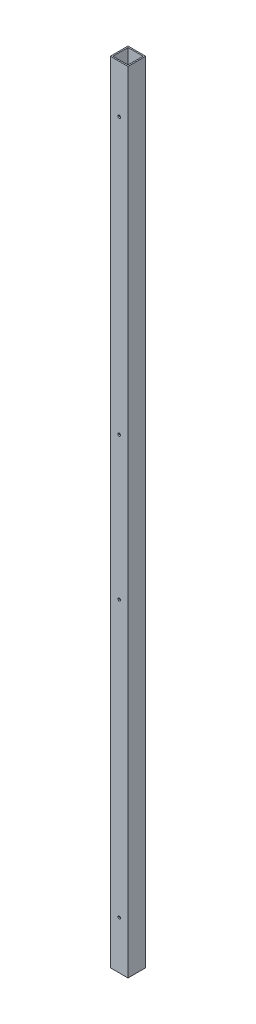
ISO-10303-21;
HEADER;
FILE_DESCRIPTION(('STEP AP214'),'2;1');
FILE_NAME('part.step','',(''),(''),'','','');
FILE_SCHEMA(('AUTOMOTIVE_DESIGN { 1 0 10303 214 1 1 1 1 }'));
ENDSEC;
DATA;
#1=APPLICATION_CONTEXT('core data for automotive mechanical design processes');
#2=APPLICATION_PROTOCOL_DEFINITION('international standard','automotive_design',2000,#1);
#3=PRODUCT_CONTEXT('',#1,'mechanical');
#4=PRODUCT('Part','Part','',(#3));
#5=PRODUCT_RELATED_PRODUCT_CATEGORY('part','',(#4));
#6=PRODUCT_DEFINITION_FORMATION('','',#4);
#7=PRODUCT_DEFINITION_CONTEXT('part definition',#1,'design');
#8=PRODUCT_DEFINITION('design','',#6,#7);
#9=PRODUCT_DEFINITION_SHAPE('','',#8);
#10=(LENGTH_UNIT() NAMED_UNIT(*) SI_UNIT(.MILLI.,.METRE.));
#11=(NAMED_UNIT(*) PLANE_ANGLE_UNIT() SI_UNIT($,.RADIAN.));
#12=(NAMED_UNIT(*) SI_UNIT($,.STERADIAN.) SOLID_ANGLE_UNIT());
#13=UNCERTAINTY_MEASURE_WITH_UNIT(LENGTH_MEASURE(1.E-05),#10,'distance_accuracy_value','');
#14=(GEOMETRIC_REPRESENTATION_CONTEXT(3) GLOBAL_UNCERTAINTY_ASSIGNED_CONTEXT((#13)) GLOBAL_UNIT_ASSIGNED_CONTEXT((#10,
#11,#12)) REPRESENTATION_CONTEXT('',''));
#15=CARTESIAN_POINT('',(0.,0.,0.));
#16=DIRECTION('',(0.,0.,1.));
#17=DIRECTION('',(1.,0.,0.));
#18=AXIS2_PLACEMENT_3D('',#15,#16,#17);
#19=CARTESIAN_POINT('',(0.,1984.375,0.));
#20=DIRECTION('',(0.,-1.,0.));
#21=DIRECTION('',(0.,0.,-1.));
#22=AXIS2_PLACEMENT_3D('',#19,#20,#21);
#23=PLANE('',#22);
#24=DIRECTION('',(0.,0.,-1.));
#25=VECTOR('',#24,1.);
#26=CARTESIAN_POINT('',(22.225,1984.375,22.225));
#27=LINE('',#26,#25);
#28=CARTESIAN_POINT('',(22.225,1984.375,22.225));
#29=VERTEX_POINT('',#28);
#30=CARTESIAN_POINT('',(22.225,1984.375,-22.225));
#31=VERTEX_POINT('',#30);
#32=EDGE_CURVE('E138',#29,#31,#27,.T.);
#33=ORIENTED_EDGE('',*,*,#32,.T.);
#34=DIRECTION('',(-1.,0.,0.));
#35=VECTOR('',#34,1.);
#36=CARTESIAN_POINT('',(-22.225,1984.375,-22.225));
#37=LINE('',#36,#35);
#38=CARTESIAN_POINT('',(-22.225,1984.375,-22.225));
#39=VERTEX_POINT('',#38);
#40=EDGE_CURVE('E141',#31,#39,#37,.T.);
#41=ORIENTED_EDGE('',*,*,#40,.T.);
#42=DIRECTION('',(0.,0.,1.));
#43=VECTOR('',#42,1.);
#44=CARTESIAN_POINT('',(-22.225,1984.375,22.225));
#45=LINE('',#44,#43);
#46=CARTESIAN_POINT('',(-22.225,1984.375,22.225));
#47=VERTEX_POINT('',#46);
#48=EDGE_CURVE('E144',#39,#47,#45,.T.);
#49=ORIENTED_EDGE('',*,*,#48,.T.);
#50=DIRECTION('',(1.,0.,0.));
#51=VECTOR('',#50,1.);
#52=CARTESIAN_POINT('',(-22.225,1984.375,22.225));
#53=LINE('',#52,#51);
#54=EDGE_CURVE('E146',#47,#29,#53,.T.);
#55=ORIENTED_EDGE('',*,*,#54,.T.);
#56=EDGE_LOOP('',(#33,#41,#49,#55));
#57=FACE_BOUND('',#56,.T.);
#58=DIRECTION('',(0.,0.,-1.));
#59=VECTOR('',#58,1.);
#60=CARTESIAN_POINT('',(19.05,1984.375,19.05));
#61=LINE('',#60,#59);
#62=CARTESIAN_POINT('',(19.05,1984.375,19.05));
#63=VERTEX_POINT('',#62);
#64=CARTESIAN_POINT('',(19.05,1984.375,-19.05));
#65=VERTEX_POINT('',#64);
#66=EDGE_CURVE('E100',#63,#65,#61,.T.);
#67=ORIENTED_EDGE('',*,*,#66,.F.);
#68=DIRECTION('',(1.,0.,0.));
#69=VECTOR('',#68,1.);
#70=CARTESIAN_POINT('',(-19.05,1984.375,19.05));
#71=LINE('',#70,#69);
#72=CARTESIAN_POINT('',(-19.05,1984.375,19.05));
#73=VERTEX_POINT('',#72);
#74=EDGE_CURVE('E122',#73,#63,#71,.T.);
#75=ORIENTED_EDGE('',*,*,#74,.F.);
#76=DIRECTION('',(0.,0.,1.));
#77=VECTOR('',#76,1.);
#78=CARTESIAN_POINT('',(-19.05,1984.375,19.05));
#79=LINE('',#78,#77);
#80=CARTESIAN_POINT('',(-19.05,1984.375,-19.05));
#81=VERTEX_POINT('',#80);
#82=EDGE_CURVE('E120',#81,#73,#79,.T.);
#83=ORIENTED_EDGE('',*,*,#82,.F.);
#84=DIRECTION('',(-1.,0.,0.));
#85=VECTOR('',#84,1.);
#86=CARTESIAN_POINT('',(-19.05,1984.375,-19.05));
#87=LINE('',#86,#85);
#88=EDGE_CURVE('E108',#65,#81,#87,.T.);
#89=ORIENTED_EDGE('',*,*,#88,.F.);
#90=EDGE_LOOP('',(#67,#75,#83,#89));
#91=FACE_BOUND('',#90,.T.);
#92=ADVANCED_FACE('F33',(#57,#91),#23,.F.);
#93=CARTESIAN_POINT('',(0.,0.,0.));
#94=DIRECTION('',(0.,-1.,0.));
#95=DIRECTION('',(0.,0.,-1.));
#96=AXIS2_PLACEMENT_3D('',#93,#94,#95);
#97=PLANE('',#96);
#98=DIRECTION('',(0.,0.,-1.));
#99=VECTOR('',#98,1.);
#100=CARTESIAN_POINT('',(22.225,0.,22.225));
#101=LINE('',#100,#99);
#102=CARTESIAN_POINT('',(22.225,0.,22.225));
#103=VERTEX_POINT('',#102);
#104=CARTESIAN_POINT('',(22.225,0.,-22.225));
#105=VERTEX_POINT('',#104);
#106=EDGE_CURVE('E116',#103,#105,#101,.T.);
#107=ORIENTED_EDGE('',*,*,#106,.F.);
#108=DIRECTION('',(1.,0.,0.));
#109=VECTOR('',#108,1.);
#110=CARTESIAN_POINT('',(-22.225,0.,22.225));
#111=LINE('',#110,#109);
#112=CARTESIAN_POINT('',(-22.225,0.,22.225));
#113=VERTEX_POINT('',#112);
#114=EDGE_CURVE('E142',#113,#103,#111,.T.);
#115=ORIENTED_EDGE('',*,*,#114,.F.);
#116=DIRECTION('',(0.,0.,1.));
#117=VECTOR('',#116,1.);
#118=CARTESIAN_POINT('',(-22.225,0.,22.225));
#119=LINE('',#118,#117);
#120=CARTESIAN_POINT('',(-22.225,0.,-22.225));
#121=VERTEX_POINT('',#120);
#122=EDGE_CURVE('E153',#121,#113,#119,.T.);
#123=ORIENTED_EDGE('',*,*,#122,.F.);
#124=DIRECTION('',(-1.,0.,0.));
#125=VECTOR('',#124,1.);
#126=CARTESIAN_POINT('',(-22.225,0.,-22.225));
#127=LINE('',#126,#125);
#128=EDGE_CURVE('E151',#105,#121,#127,.T.);
#129=ORIENTED_EDGE('',*,*,#128,.F.);
#130=EDGE_LOOP('',(#107,#115,#123,#129));
#131=FACE_BOUND('',#130,.T.);
#132=DIRECTION('',(1.,0.,0.));
#133=VECTOR('',#132,1.);
#134=CARTESIAN_POINT('',(-19.05,0.,19.05));
#135=LINE('',#134,#133);
#136=CARTESIAN_POINT('',(-19.05,0.,19.05));
#137=VERTEX_POINT('',#136);
#138=CARTESIAN_POINT('',(19.05,0.,19.05));
#139=VERTEX_POINT('',#138);
#140=EDGE_CURVE('E109',#137,#139,#135,.T.);
#141=ORIENTED_EDGE('',*,*,#140,.T.);
#142=DIRECTION('',(0.,0.,-1.));
#143=VECTOR('',#142,1.);
#144=CARTESIAN_POINT('',(19.05,0.,19.05));
#145=LINE('',#144,#143);
#146=CARTESIAN_POINT('',(19.05,0.,-19.05));
#147=VERTEX_POINT('',#146);
#148=EDGE_CURVE('E58',#139,#147,#145,.T.);
#149=ORIENTED_EDGE('',*,*,#148,.T.);
#150=DIRECTION('',(-1.,0.,0.));
#151=VECTOR('',#150,1.);
#152=CARTESIAN_POINT('',(-19.05,0.,-19.05));
#153=LINE('',#152,#151);
#154=CARTESIAN_POINT('',(-19.05,0.,-19.05));
#155=VERTEX_POINT('',#154);
#156=EDGE_CURVE('E115',#147,#155,#153,.T.);
#157=ORIENTED_EDGE('',*,*,#156,.T.);
#158=DIRECTION('',(0.,0.,1.));
#159=VECTOR('',#158,1.);
#160=CARTESIAN_POINT('',(-19.05,0.,19.05));
#161=LINE('',#160,#159);
#162=EDGE_CURVE('E130',#155,#137,#161,.T.);
#163=ORIENTED_EDGE('',*,*,#162,.T.);
#164=EDGE_LOOP('',(#141,#149,#157,#163));
#165=FACE_BOUND('',#164,.T.);
#166=ADVANCED_FACE('F214',(#131,#165),#97,.T.);
#167=CARTESIAN_POINT('',(22.225,1984.375,22.225));
#168=DIRECTION('',(-1.,0.,0.));
#169=DIRECTION('',(0.,0.,1.));
#170=AXIS2_PLACEMENT_3D('',#167,#168,#169);
#171=PLANE('',#170);
#172=ORIENTED_EDGE('',*,*,#106,.T.);
#173=DIRECTION('',(0.,-1.,0.));
#174=VECTOR('',#173,1.);
#175=CARTESIAN_POINT('',(22.225,1984.375,-22.225));
#176=LINE('',#175,#174);
#177=EDGE_CURVE('E11',#31,#105,#176,.T.);
#178=ORIENTED_EDGE('',*,*,#177,.F.);
#179=ORIENTED_EDGE('',*,*,#32,.F.);
#180=DIRECTION('',(0.,-1.,0.));
#181=VECTOR('',#180,1.);
#182=CARTESIAN_POINT('',(22.225,1984.375,22.225));
#183=LINE('',#182,#181);
#184=EDGE_CURVE('E148',#29,#103,#183,.T.);
#185=ORIENTED_EDGE('',*,*,#184,.T.);
#186=EDGE_LOOP('',(#172,#178,#179,#185));
#187=FACE_BOUND('',#186,.T.);
#188=ADVANCED_FACE('F35',(#187),#171,.F.);
#189=CARTESIAN_POINT('',(-22.225,1984.375,-22.225));
#190=DIRECTION('',(0.,0.,1.));
#191=DIRECTION('',(1.,0.,0.));
#192=AXIS2_PLACEMENT_3D('',#189,#190,#191);
#193=PLANE('',#192);
#194=CARTESIAN_POINT('',(0.,812.8,-22.225));
#195=DIRECTION('',(0.,0.,1.));
#196=DIRECTION('',(1.,0.,0.));
#197=AXIS2_PLACEMENT_3D('',#194,#195,#196);
#198=CIRCLE('',#197,3.37350099999999);
#199=CARTESIAN_POINT('',(3.37350099999999,812.8,-22.225));
#200=VERTEX_POINT('',#199);
#201=EDGE_CURVE('E249',#200,#200,#198,.T.);
#202=ORIENTED_EDGE('',*,*,#201,.T.);
#203=EDGE_LOOP('',(#202));
#204=FACE_BOUND('',#203,.T.);
#205=CARTESIAN_POINT('',(0.,120.65,-22.225));
#206=DIRECTION('',(0.,0.,1.));
#207=DIRECTION('',(1.,0.,0.));
#208=AXIS2_PLACEMENT_3D('',#205,#206,#207);
#209=CIRCLE('',#208,3.37350099999999);
#210=CARTESIAN_POINT('',(3.37350099999999,120.65,-22.225));
#211=VERTEX_POINT('',#210);
#212=EDGE_CURVE('E174',#211,#211,#209,.T.);
#213=ORIENTED_EDGE('',*,*,#212,.T.);
#214=EDGE_LOOP('',(#213));
#215=FACE_BOUND('',#214,.T.);
#216=CARTESIAN_POINT('',(0.,1171.575,-22.225));
#217=DIRECTION('',(0.,0.,1.));
#218=DIRECTION('',(1.,0.,0.));
#219=AXIS2_PLACEMENT_3D('',#216,#217,#218);
#220=CIRCLE('',#219,3.37350099999999);
#221=CARTESIAN_POINT('',(3.37350099999998,1171.575,-22.225));
#222=VERTEX_POINT('',#221);
#223=EDGE_CURVE('E170',#222,#222,#220,.T.);
#224=ORIENTED_EDGE('',*,*,#223,.T.);
#225=EDGE_LOOP('',(#224));
#226=FACE_BOUND('',#225,.T.);
#227=CARTESIAN_POINT('',(0.,1863.725,-22.225));
#228=DIRECTION('',(0.,0.,1.));
#229=DIRECTION('',(1.,0.,0.));
#230=AXIS2_PLACEMENT_3D('',#227,#228,#229);
#231=CIRCLE('',#230,3.37350099999999);
#232=CARTESIAN_POINT('',(3.37350099999998,1863.725,-22.225));
#233=VERTEX_POINT('',#232);
#234=EDGE_CURVE('E166',#233,#233,#231,.T.);
#235=ORIENTED_EDGE('',*,*,#234,.T.);
#236=EDGE_LOOP('',(#235));
#237=FACE_BOUND('',#236,.T.);
#238=ORIENTED_EDGE('',*,*,#128,.T.);
#239=DIRECTION('',(0.,-1.,0.));
#240=VECTOR('',#239,1.);
#241=CARTESIAN_POINT('',(-22.225,1984.375,-22.225));
#242=LINE('',#241,#240);
#243=EDGE_CURVE('E42',#39,#121,#242,.T.);
#244=ORIENTED_EDGE('',*,*,#243,.F.);
#245=ORIENTED_EDGE('',*,*,#40,.F.);
#246=ORIENTED_EDGE('',*,*,#177,.T.);
#247=EDGE_LOOP('',(#238,#244,#245,#246));
#248=FACE_BOUND('',#247,.T.);
#249=ADVANCED_FACE('F239',(#204,#215,#226,#237,#248),#193,.F.);
#250=CARTESIAN_POINT('',(-22.225,1984.375,22.225));
#251=DIRECTION('',(1.,0.,0.));
#252=DIRECTION('',(0.,0.,-1.));
#253=AXIS2_PLACEMENT_3D('',#250,#251,#252);
#254=PLANE('',#253);
#255=ORIENTED_EDGE('',*,*,#122,.T.);
#256=DIRECTION('',(0.,-1.,0.));
#257=VECTOR('',#256,1.);
#258=CARTESIAN_POINT('',(-22.225,1984.375,22.225));
#259=LINE('',#258,#257);
#260=EDGE_CURVE('E158',#47,#113,#259,.T.);
#261=ORIENTED_EDGE('',*,*,#260,.F.);
#262=ORIENTED_EDGE('',*,*,#48,.F.);
#263=ORIENTED_EDGE('',*,*,#243,.T.);
#264=EDGE_LOOP('',(#255,#261,#262,#263));
#265=FACE_BOUND('',#264,.T.);
#266=ADVANCED_FACE('F236',(#265),#254,.F.);
#267=CARTESIAN_POINT('',(-22.225,1984.375,22.225));
#268=DIRECTION('',(0.,0.,-1.));
#269=DIRECTION('',(-1.,0.,0.));
#270=AXIS2_PLACEMENT_3D('',#267,#268,#269);
#271=PLANE('',#270);
#272=CARTESIAN_POINT('',(0.,812.8,22.225));
#273=DIRECTION('',(0.,0.,1.));
#274=DIRECTION('',(1.,0.,0.));
#275=AXIS2_PLACEMENT_3D('',#272,#273,#274);
#276=CIRCLE('',#275,3.37350099999999);
#277=CARTESIAN_POINT('',(3.37350099999999,812.8,22.225));
#278=VERTEX_POINT('',#277);
#279=EDGE_CURVE('E296',#278,#278,#276,.T.);
#280=ORIENTED_EDGE('',*,*,#279,.F.);
#281=EDGE_LOOP('',(#280));
#282=FACE_BOUND('',#281,.T.);
#283=CARTESIAN_POINT('',(0.,120.65,22.225));
#284=DIRECTION('',(0.,0.,1.));
#285=DIRECTION('',(1.,0.,0.));
#286=AXIS2_PLACEMENT_3D('',#283,#284,#285);
#287=CIRCLE('',#286,3.37350099999999);
#288=CARTESIAN_POINT('',(3.37350099999999,120.65,22.225));
#289=VERTEX_POINT('',#288);
#290=EDGE_CURVE('E181',#289,#289,#287,.T.);
#291=ORIENTED_EDGE('',*,*,#290,.F.);
#292=EDGE_LOOP('',(#291));
#293=FACE_BOUND('',#292,.T.);
#294=CARTESIAN_POINT('',(0.,1171.575,22.225));
#295=DIRECTION('',(0.,0.,1.));
#296=DIRECTION('',(1.,0.,0.));
#297=AXIS2_PLACEMENT_3D('',#294,#295,#296);
#298=CIRCLE('',#297,3.37350099999999);
#299=CARTESIAN_POINT('',(3.37350099999997,1171.575,22.225));
#300=VERTEX_POINT('',#299);
#301=EDGE_CURVE('E178',#300,#300,#298,.T.);
#302=ORIENTED_EDGE('',*,*,#301,.F.);
#303=EDGE_LOOP('',(#302));
#304=FACE_BOUND('',#303,.T.);
#305=CARTESIAN_POINT('',(0.,1863.725,22.225));
#306=DIRECTION('',(0.,0.,1.));
#307=DIRECTION('',(1.,0.,0.));
#308=AXIS2_PLACEMENT_3D('',#305,#306,#307);
#309=CIRCLE('',#308,3.37350099999999);
#310=CARTESIAN_POINT('',(3.37350099999997,1863.725,22.225));
#311=VERTEX_POINT('',#310);
#312=EDGE_CURVE('E196',#311,#311,#309,.T.);
#313=ORIENTED_EDGE('',*,*,#312,.F.);
#314=EDGE_LOOP('',(#313));
#315=FACE_BOUND('',#314,.T.);
#316=ORIENTED_EDGE('',*,*,#114,.T.);
#317=ORIENTED_EDGE('',*,*,#184,.F.);
#318=ORIENTED_EDGE('',*,*,#54,.F.);
#319=ORIENTED_EDGE('',*,*,#260,.T.);
#320=EDGE_LOOP('',(#316,#317,#318,#319));
#321=FACE_BOUND('',#320,.T.);
#322=ADVANCED_FACE('F233',(#282,#293,#304,#315,#321),#271,.F.);
#323=CARTESIAN_POINT('',(19.05,1984.375,19.05));
#324=DIRECTION('',(-1.,0.,0.));
#325=DIRECTION('',(0.,0.,1.));
#326=AXIS2_PLACEMENT_3D('',#323,#324,#325);
#327=PLANE('',#326);
#328=ORIENTED_EDGE('',*,*,#148,.F.);
#329=DIRECTION('',(0.,-1.,0.));
#330=VECTOR('',#329,1.);
#331=CARTESIAN_POINT('',(19.05,1984.375,19.05));
#332=LINE('',#331,#330);
#333=EDGE_CURVE('E104',#63,#139,#332,.T.);
#334=ORIENTED_EDGE('',*,*,#333,.F.);
#335=ORIENTED_EDGE('',*,*,#66,.T.);
#336=DIRECTION('',(0.,-1.,0.));
#337=VECTOR('',#336,1.);
#338=CARTESIAN_POINT('',(19.05,1984.375,-19.05));
#339=LINE('',#338,#337);
#340=EDGE_CURVE('E103',#65,#147,#339,.T.);
#341=ORIENTED_EDGE('',*,*,#340,.T.);
#342=EDGE_LOOP('',(#328,#334,#335,#341));
#343=FACE_BOUND('',#342,.T.);
#344=ADVANCED_FACE('F102',(#343),#327,.T.);
#345=CARTESIAN_POINT('',(-19.05,1984.375,-19.05));
#346=DIRECTION('',(0.,0.,1.));
#347=DIRECTION('',(1.,0.,0.));
#348=AXIS2_PLACEMENT_3D('',#345,#346,#347);
#349=PLANE('',#348);
#350=CARTESIAN_POINT('',(0.,812.8,-19.05));
#351=DIRECTION('',(0.,0.,1.));
#352=DIRECTION('',(1.,0.,0.));
#353=AXIS2_PLACEMENT_3D('',#350,#351,#352);
#354=CIRCLE('',#353,3.37350099999999);
#355=CARTESIAN_POINT('',(3.37350099999999,812.8,-19.05));
#356=VERTEX_POINT('',#355);
#357=EDGE_CURVE('E37',#356,#356,#354,.T.);
#358=ORIENTED_EDGE('',*,*,#357,.F.);
#359=EDGE_LOOP('',(#358));
#360=FACE_BOUND('',#359,.T.);
#361=CARTESIAN_POINT('',(0.,120.65,-19.05));
#362=DIRECTION('',(0.,0.,1.));
#363=DIRECTION('',(1.,0.,0.));
#364=AXIS2_PLACEMENT_3D('',#361,#362,#363);
#365=CIRCLE('',#364,3.37350099999999);
#366=CARTESIAN_POINT('',(3.37350099999999,120.65,-19.05));
#367=VERTEX_POINT('',#366);
#368=EDGE_CURVE('E173',#367,#367,#365,.T.);
#369=ORIENTED_EDGE('',*,*,#368,.F.);
#370=EDGE_LOOP('',(#369));
#371=FACE_BOUND('',#370,.T.);
#372=CARTESIAN_POINT('',(0.,1171.575,-19.05));
#373=DIRECTION('',(0.,0.,1.));
#374=DIRECTION('',(1.,0.,0.));
#375=AXIS2_PLACEMENT_3D('',#372,#373,#374);
#376=CIRCLE('',#375,3.37350099999999);
#377=CARTESIAN_POINT('',(3.37350099999998,1171.575,-19.05));
#378=VERTEX_POINT('',#377);
#379=EDGE_CURVE('E169',#378,#378,#376,.T.);
#380=ORIENTED_EDGE('',*,*,#379,.F.);
#381=EDGE_LOOP('',(#380));
#382=FACE_BOUND('',#381,.T.);
#383=CARTESIAN_POINT('',(0.,1863.725,-19.05));
#384=DIRECTION('',(0.,0.,1.));
#385=DIRECTION('',(1.,0.,0.));
#386=AXIS2_PLACEMENT_3D('',#383,#384,#385);
#387=CIRCLE('',#386,3.37350099999999);
#388=CARTESIAN_POINT('',(3.37350099999998,1863.725,-19.05));
#389=VERTEX_POINT('',#388);
#390=EDGE_CURVE('E163',#389,#389,#387,.T.);
#391=ORIENTED_EDGE('',*,*,#390,.F.);
#392=EDGE_LOOP('',(#391));
#393=FACE_BOUND('',#392,.T.);
#394=ORIENTED_EDGE('',*,*,#156,.F.);
#395=ORIENTED_EDGE('',*,*,#340,.F.);
#396=ORIENTED_EDGE('',*,*,#88,.T.);
#397=DIRECTION('',(0.,-1.,0.));
#398=VECTOR('',#397,1.);
#399=CARTESIAN_POINT('',(-19.05,1984.375,-19.05));
#400=LINE('',#399,#398);
#401=EDGE_CURVE('E117',#81,#155,#400,.T.);
#402=ORIENTED_EDGE('',*,*,#401,.T.);
#403=EDGE_LOOP('',(#394,#395,#396,#402));
#404=FACE_BOUND('',#403,.T.);
#405=ADVANCED_FACE('F112',(#360,#371,#382,#393,#404),#349,.T.);
#406=CARTESIAN_POINT('',(-19.05,1984.375,19.05));
#407=DIRECTION('',(1.,0.,0.));
#408=DIRECTION('',(0.,0.,-1.));
#409=AXIS2_PLACEMENT_3D('',#406,#407,#408);
#410=PLANE('',#409);
#411=ORIENTED_EDGE('',*,*,#162,.F.);
#412=ORIENTED_EDGE('',*,*,#401,.F.);
#413=ORIENTED_EDGE('',*,*,#82,.T.);
#414=DIRECTION('',(0.,-1.,0.));
#415=VECTOR('',#414,1.);
#416=CARTESIAN_POINT('',(-19.05,1984.375,19.05));
#417=LINE('',#416,#415);
#418=EDGE_CURVE('E50',#73,#137,#417,.T.);
#419=ORIENTED_EDGE('',*,*,#418,.T.);
#420=EDGE_LOOP('',(#411,#412,#413,#419));
#421=FACE_BOUND('',#420,.T.);
#422=ADVANCED_FACE('F209',(#421),#410,.T.);
#423=CARTESIAN_POINT('',(-19.05,1984.375,19.05));
#424=DIRECTION('',(0.,0.,-1.));
#425=DIRECTION('',(-1.,0.,0.));
#426=AXIS2_PLACEMENT_3D('',#423,#424,#425);
#427=PLANE('',#426);
#428=CARTESIAN_POINT('',(0.,812.8,19.05));
#429=DIRECTION('',(0.,0.,-1.));
#430=DIRECTION('',(-1.,0.,0.));
#431=AXIS2_PLACEMENT_3D('',#428,#429,#430);
#432=CIRCLE('',#431,3.37350099999999);
#433=CARTESIAN_POINT('',(-3.37350099999999,812.8,19.05));
#434=VERTEX_POINT('',#433);
#435=EDGE_CURVE('E186',#434,#434,#432,.T.);
#436=ORIENTED_EDGE('',*,*,#435,.F.);
#437=EDGE_LOOP('',(#436));
#438=FACE_BOUND('',#437,.T.);
#439=CARTESIAN_POINT('',(0.,120.65,19.05));
#440=DIRECTION('',(0.,0.,-1.));
#441=DIRECTION('',(-1.,0.,0.));
#442=AXIS2_PLACEMENT_3D('',#439,#440,#441);
#443=CIRCLE('',#442,3.37350099999999);
#444=CARTESIAN_POINT('',(-3.37350099999999,120.65,19.05));
#445=VERTEX_POINT('',#444);
#446=EDGE_CURVE('E171',#445,#445,#443,.T.);
#447=ORIENTED_EDGE('',*,*,#446,.F.);
#448=EDGE_LOOP('',(#447));
#449=FACE_BOUND('',#448,.T.);
#450=CARTESIAN_POINT('',(0.,1171.575,19.05));
#451=DIRECTION('',(0.,0.,-1.));
#452=DIRECTION('',(-1.,0.,0.));
#453=AXIS2_PLACEMENT_3D('',#450,#451,#452);
#454=CIRCLE('',#453,3.37350099999999);
#455=CARTESIAN_POINT('',(-3.37350100000001,1171.575,19.05));
#456=VERTEX_POINT('',#455);
#457=EDGE_CURVE('E167',#456,#456,#454,.T.);
#458=ORIENTED_EDGE('',*,*,#457,.F.);
#459=EDGE_LOOP('',(#458));
#460=FACE_BOUND('',#459,.T.);
#461=CARTESIAN_POINT('',(0.,1863.725,19.05));
#462=DIRECTION('',(0.,0.,-1.));
#463=DIRECTION('',(-1.,0.,0.));
#464=AXIS2_PLACEMENT_3D('',#461,#462,#463);
#465=CIRCLE('',#464,3.37350099999999);
#466=CARTESIAN_POINT('',(-3.37350100000001,1863.725,19.05));
#467=VERTEX_POINT('',#466);
#468=EDGE_CURVE('E128',#467,#467,#465,.T.);
#469=ORIENTED_EDGE('',*,*,#468,.F.);
#470=EDGE_LOOP('',(#469));
#471=FACE_BOUND('',#470,.T.);
#472=ORIENTED_EDGE('',*,*,#140,.F.);
#473=ORIENTED_EDGE('',*,*,#418,.F.);
#474=ORIENTED_EDGE('',*,*,#74,.T.);
#475=ORIENTED_EDGE('',*,*,#333,.T.);
#476=EDGE_LOOP('',(#472,#473,#474,#475));
#477=FACE_BOUND('',#476,.T.);
#478=ADVANCED_FACE('F206',(#438,#449,#460,#471,#477),#427,.T.);
#479=CARTESIAN_POINT('',(0.,1863.725,22.225));
#480=DIRECTION('',(0.,0.,1.));
#481=DIRECTION('',(1.,0.,0.));
#482=AXIS2_PLACEMENT_3D('',#479,#480,#481);
#483=CYLINDRICAL_SURFACE('',#482,3.37350099999999);
#484=ORIENTED_EDGE('',*,*,#390,.T.);
#485=EDGE_LOOP('',(#484));
#486=FACE_BOUND('',#485,.T.);
#487=ORIENTED_EDGE('',*,*,#234,.F.);
#488=EDGE_LOOP('',(#487));
#489=FACE_BOUND('',#488,.T.);
#490=ADVANCED_FACE('F208',(#486,#489),#483,.F.);
#491=ORIENTED_EDGE('',*,*,#468,.T.);
#492=EDGE_LOOP('',(#491));
#493=FACE_BOUND('',#492,.T.);
#494=ORIENTED_EDGE('',*,*,#312,.T.);
#495=EDGE_LOOP('',(#494));
#496=FACE_BOUND('',#495,.T.);
#497=ADVANCED_FACE('F203',(#493,#496),#483,.F.);
#498=CARTESIAN_POINT('',(0.,1171.575,22.225));
#499=DIRECTION('',(0.,0.,1.));
#500=DIRECTION('',(1.,0.,0.));
#501=AXIS2_PLACEMENT_3D('',#498,#499,#500);
#502=CYLINDRICAL_SURFACE('',#501,3.37350099999999);
#503=ORIENTED_EDGE('',*,*,#457,.T.);
#504=EDGE_LOOP('',(#503));
#505=FACE_BOUND('',#504,.T.);
#506=ORIENTED_EDGE('',*,*,#301,.T.);
#507=EDGE_LOOP('',(#506));
#508=FACE_BOUND('',#507,.T.);
#509=ADVANCED_FACE('F273',(#505,#508),#502,.F.);
#510=ORIENTED_EDGE('',*,*,#379,.T.);
#511=EDGE_LOOP('',(#510));
#512=FACE_BOUND('',#511,.T.);
#513=ORIENTED_EDGE('',*,*,#223,.F.);
#514=EDGE_LOOP('',(#513));
#515=FACE_BOUND('',#514,.T.);
#516=ADVANCED_FACE('F277',(#512,#515),#502,.F.);
#517=CARTESIAN_POINT('',(0.,120.65,22.225));
#518=DIRECTION('',(0.,0.,1.));
#519=DIRECTION('',(1.,0.,0.));
#520=AXIS2_PLACEMENT_3D('',#517,#518,#519);
#521=CYLINDRICAL_SURFACE('',#520,3.37350099999999);
#522=ORIENTED_EDGE('',*,*,#446,.T.);
#523=EDGE_LOOP('',(#522));
#524=FACE_BOUND('',#523,.T.);
#525=ORIENTED_EDGE('',*,*,#290,.T.);
#526=EDGE_LOOP('',(#525));
#527=FACE_BOUND('',#526,.T.);
#528=ADVANCED_FACE('F279',(#524,#527),#521,.F.);
#529=ORIENTED_EDGE('',*,*,#368,.T.);
#530=EDGE_LOOP('',(#529));
#531=FACE_BOUND('',#530,.T.);
#532=ORIENTED_EDGE('',*,*,#212,.F.);
#533=EDGE_LOOP('',(#532));
#534=FACE_BOUND('',#533,.T.);
#535=ADVANCED_FACE('F282',(#531,#534),#521,.F.);
#536=CARTESIAN_POINT('',(0.,812.8,22.225));
#537=DIRECTION('',(0.,0.,1.));
#538=DIRECTION('',(1.,0.,0.));
#539=AXIS2_PLACEMENT_3D('',#536,#537,#538);
#540=CYLINDRICAL_SURFACE('',#539,3.37350099999999);
#541=ORIENTED_EDGE('',*,*,#357,.T.);
#542=EDGE_LOOP('',(#541));
#543=FACE_BOUND('',#542,.T.);
#544=ORIENTED_EDGE('',*,*,#201,.F.);
#545=EDGE_LOOP('',(#544));
#546=FACE_BOUND('',#545,.T.);
#547=ADVANCED_FACE('F283',(#543,#546),#540,.F.);
#548=ORIENTED_EDGE('',*,*,#435,.T.);
#549=EDGE_LOOP('',(#548));
#550=FACE_BOUND('',#549,.T.);
#551=ORIENTED_EDGE('',*,*,#279,.T.);
#552=EDGE_LOOP('',(#551));
#553=FACE_BOUND('',#552,.T.);
#554=ADVANCED_FACE('F285',(#550,#553),#540,.F.);
#555=CLOSED_SHELL('',(#92,#166,#188,#249,#266,#322,#344,#405,#422,#478,#490,#497,#509,#516,#528,
#535,#547,#554));
#556=MANIFOLD_SOLID_BREP('B2',#555);
#557=ADVANCED_BREP_SHAPE_REPRESENTATION('',(#18,#556),#14);
#558=SHAPE_DEFINITION_REPRESENTATION(#9,#557);
ENDSEC;
END-ISO-10303-21;
